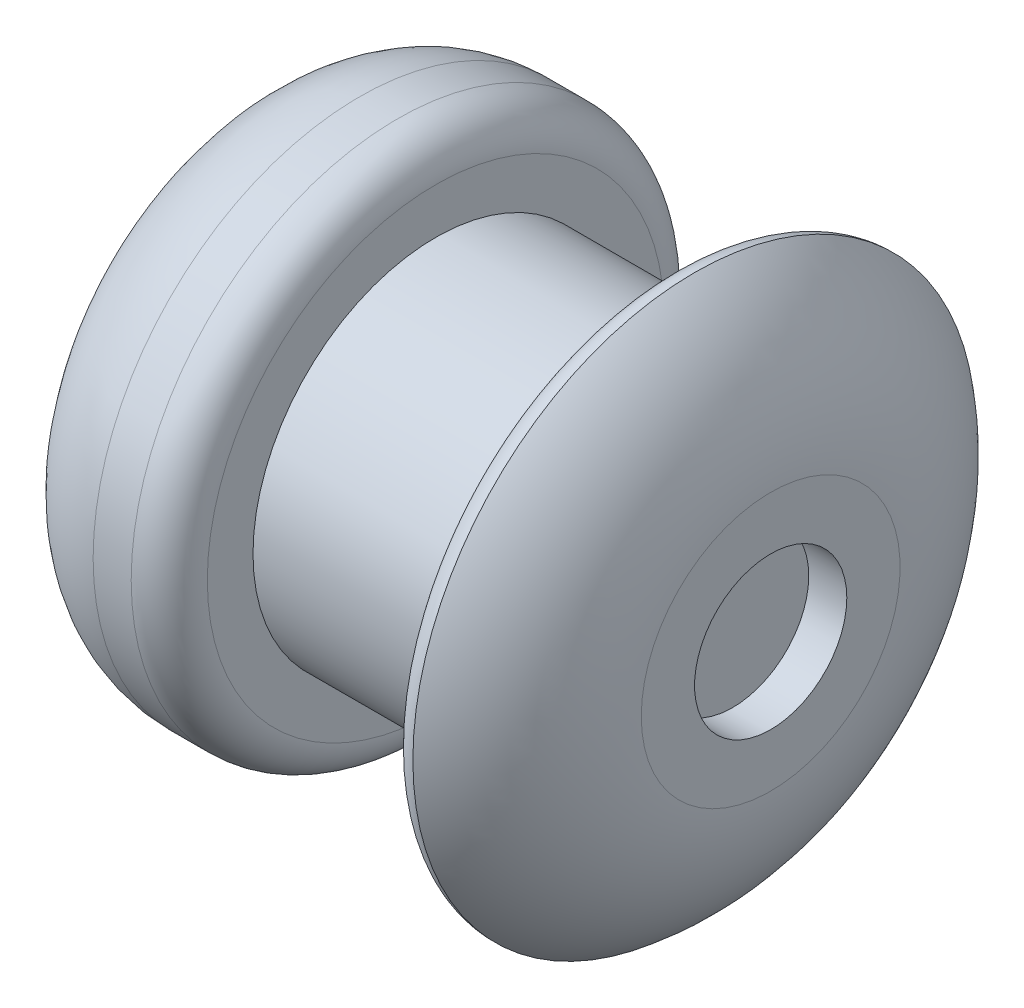
ISO-10303-21;
HEADER;
FILE_DESCRIPTION(('STEP AP214'),'2;1');
FILE_NAME('part.step','',(''),(''),'','','');
FILE_SCHEMA(('AUTOMOTIVE_DESIGN { 1 0 10303 214 1 1 1 1 }'));
ENDSEC;
DATA;
#1=APPLICATION_CONTEXT('core data for automotive mechanical design processes');
#2=APPLICATION_PROTOCOL_DEFINITION('international standard','automotive_design',2000,#1);
#3=PRODUCT_CONTEXT('',#1,'mechanical');
#4=PRODUCT('Part','Part','',(#3));
#5=PRODUCT_RELATED_PRODUCT_CATEGORY('part','',(#4));
#6=PRODUCT_DEFINITION_FORMATION('','',#4);
#7=PRODUCT_DEFINITION_CONTEXT('part definition',#1,'design');
#8=PRODUCT_DEFINITION('design','',#6,#7);
#9=PRODUCT_DEFINITION_SHAPE('','',#8);
#10=(LENGTH_UNIT() NAMED_UNIT(*) SI_UNIT(.MILLI.,.METRE.));
#11=(NAMED_UNIT(*) PLANE_ANGLE_UNIT() SI_UNIT($,.RADIAN.));
#12=(NAMED_UNIT(*) SI_UNIT($,.STERADIAN.) SOLID_ANGLE_UNIT());
#13=UNCERTAINTY_MEASURE_WITH_UNIT(LENGTH_MEASURE(1.E-05),#10,'distance_accuracy_value','');
#14=(GEOMETRIC_REPRESENTATION_CONTEXT(3) GLOBAL_UNCERTAINTY_ASSIGNED_CONTEXT((#13)) GLOBAL_UNIT_ASSIGNED_CONTEXT((#10,
#11,#12)) REPRESENTATION_CONTEXT('',''));
#15=CARTESIAN_POINT('',(0.,0.,0.));
#16=DIRECTION('',(0.,0.,1.));
#17=DIRECTION('',(1.,0.,0.));
#18=AXIS2_PLACEMENT_3D('',#15,#16,#17);
#19=CARTESIAN_POINT('',(7.94999999999996,0.,0.));
#20=DIRECTION('',(-1.,0.,0.));
#21=DIRECTION('',(0.,0.,1.));
#22=AXIS2_PLACEMENT_3D('',#19,#20,#21);
#23=CYLINDRICAL_SURFACE('',#22,2.4);
#24=CARTESIAN_POINT('',(7.94999999999996,0.,0.));
#25=DIRECTION('',(1.,0.,0.));
#26=DIRECTION('',(0.,0.,-1.));
#27=AXIS2_PLACEMENT_3D('',#24,#25,#26);
#28=CIRCLE('',#27,2.4);
#29=CARTESIAN_POINT('',(7.94999999999996,0.,-2.39999999999994));
#30=VERTEX_POINT('',#29);
#31=EDGE_CURVE('E54',#30,#30,#28,.T.);
#32=ORIENTED_EDGE('',*,*,#31,.F.);
#33=EDGE_LOOP('',(#32));
#34=FACE_BOUND('',#33,.T.);
#35=CARTESIAN_POINT('',(4.85000000000002,0.,0.));
#36=DIRECTION('',(-1.,0.,0.));
#37=DIRECTION('',(0.,0.,1.));
#38=AXIS2_PLACEMENT_3D('',#35,#36,#37);
#39=CIRCLE('',#38,2.4);
#40=CARTESIAN_POINT('',(4.85000000000002,0.,2.40000000000003));
#41=VERTEX_POINT('',#40);
#42=EDGE_CURVE('E55',#41,#41,#39,.T.);
#43=ORIENTED_EDGE('',*,*,#42,.F.);
#44=EDGE_LOOP('',(#43));
#45=FACE_BOUND('',#44,.T.);
#46=ADVANCED_FACE('F34',(#34,#45),#23,.T.);
#47=CARTESIAN_POINT('',(7.94999999999996,0.,0.));
#48=DIRECTION('',(1.,0.,0.));
#49=DIRECTION('',(0.,0.,-1.));
#50=AXIS2_PLACEMENT_3D('',#47,#48,#49);
#51=PLANE('',#50);
#52=CARTESIAN_POINT('',(7.94999999999996,0.,0.));
#53=DIRECTION('',(1.,0.,0.));
#54=DIRECTION('',(0.,0.,-1.));
#55=AXIS2_PLACEMENT_3D('',#52,#53,#54);
#56=CIRCLE('',#55,3.4);
#57=CARTESIAN_POINT('',(7.94999999999996,0.,-3.39999999999994));
#58=VERTEX_POINT('',#57);
#59=EDGE_CURVE('E10',#58,#58,#56,.F.);
#60=ORIENTED_EDGE('',*,*,#59,.T.);
#61=EDGE_LOOP('',(#60));
#62=FACE_BOUND('',#61,.T.);
#63=ORIENTED_EDGE('',*,*,#31,.T.);
#64=EDGE_LOOP('',(#63));
#65=FACE_BOUND('',#64,.T.);
#66=ADVANCED_FACE('F95',(#62,#65),#51,.F.);
#67=CARTESIAN_POINT('',(4.85000000000002,0.,0.));
#68=DIRECTION('',(-1.,0.,0.));
#69=DIRECTION('',(0.,0.,1.));
#70=AXIS2_PLACEMENT_3D('',#67,#68,#69);
#71=PLANE('',#70);
#72=CARTESIAN_POINT('',(4.85000000000002,0.,0.));
#73=DIRECTION('',(-1.,0.,0.));
#74=DIRECTION('',(0.,0.,1.));
#75=AXIS2_PLACEMENT_3D('',#72,#73,#74);
#76=CIRCLE('',#75,3.);
#77=CARTESIAN_POINT('',(4.85000000000002,0.,3.00000000000003));
#78=VERTEX_POINT('',#77);
#79=EDGE_CURVE('E41',#78,#78,#76,.F.);
#80=ORIENTED_EDGE('',*,*,#79,.T.);
#81=EDGE_LOOP('',(#80));
#82=FACE_BOUND('',#81,.T.);
#83=ORIENTED_EDGE('',*,*,#42,.T.);
#84=EDGE_LOOP('',(#83));
#85=FACE_BOUND('',#84,.T.);
#86=ADVANCED_FACE('F101',(#82,#85),#71,.F.);
#87=CARTESIAN_POINT('',(2.35000000000005,0.,0.));
#88=DIRECTION('',(1.,0.,0.));
#89=DIRECTION('',(0.,0.,-1.));
#90=AXIS2_PLACEMENT_3D('',#87,#88,#89);
#91=CYLINDRICAL_SURFACE('',#90,3.5);
#92=CARTESIAN_POINT('',(4.34999999999997,0.,0.));
#93=DIRECTION('',(-1.,0.,0.));
#94=DIRECTION('',(0.,0.,1.));
#95=AXIS2_PLACEMENT_3D('',#92,#93,#94);
#96=CIRCLE('',#95,3.5);
#97=CARTESIAN_POINT('',(4.34999999999997,0.,3.5));
#98=VERTEX_POINT('',#97);
#99=EDGE_CURVE('E45',#98,#98,#96,.T.);
#100=ORIENTED_EDGE('',*,*,#99,.T.);
#101=EDGE_LOOP('',(#100));
#102=FACE_BOUND('',#101,.T.);
#103=CARTESIAN_POINT('',(3.84999999999996,0.,0.));
#104=DIRECTION('',(-1.,0.,0.));
#105=DIRECTION('',(0.,0.,1.));
#106=AXIS2_PLACEMENT_3D('',#103,#104,#105);
#107=CIRCLE('',#106,3.5);
#108=CARTESIAN_POINT('',(3.84999999999996,0.,3.50000000000006));
#109=VERTEX_POINT('',#108);
#110=EDGE_CURVE('E49',#109,#109,#107,.F.);
#111=ORIENTED_EDGE('',*,*,#110,.T.);
#112=EDGE_LOOP('',(#111));
#113=FACE_BOUND('',#112,.T.);
#114=ADVANCED_FACE('F110',(#102,#113),#91,.T.);
#115=CARTESIAN_POINT('',(3.84999999999996,0.,0.));
#116=DIRECTION('',(-1.,0.,0.));
#117=DIRECTION('',(0.,0.,1.));
#118=AXIS2_PLACEMENT_3D('',#115,#116,#117);
#119=TOROIDAL_SURFACE('',#118,2.,1.5);
#120=ORIENTED_EDGE('',*,*,#110,.F.);
#121=EDGE_LOOP('',(#120));
#122=FACE_BOUND('',#121,.T.);
#123=CARTESIAN_POINT('',(2.35000000000005,0.,0.));
#124=DIRECTION('',(-1.,0.,0.));
#125=DIRECTION('',(0.,0.,1.));
#126=AXIS2_PLACEMENT_3D('',#123,#124,#125);
#127=CIRCLE('',#126,2.);
#128=CARTESIAN_POINT('',(2.35000000000005,0.,2.00000000000003));
#129=VERTEX_POINT('',#128);
#130=EDGE_CURVE('E61',#129,#129,#127,.T.);
#131=ORIENTED_EDGE('',*,*,#130,.F.);
#132=EDGE_LOOP('',(#131));
#133=FACE_BOUND('',#132,.T.);
#134=ADVANCED_FACE('F107',(#122,#133),#119,.T.);
#135=CARTESIAN_POINT('',(4.34999999999997,0.,0.));
#136=DIRECTION('',(-1.,0.,0.));
#137=DIRECTION('',(0.,0.,1.));
#138=AXIS2_PLACEMENT_3D('',#135,#136,#137);
#139=TOROIDAL_SURFACE('',#138,3.,0.5);
#140=ORIENTED_EDGE('',*,*,#79,.F.);
#141=EDGE_LOOP('',(#140));
#142=FACE_BOUND('',#141,.T.);
#143=ORIENTED_EDGE('',*,*,#99,.F.);
#144=EDGE_LOOP('',(#143));
#145=FACE_BOUND('',#144,.T.);
#146=ADVANCED_FACE('F109',(#142,#145),#139,.T.);
#147=CARTESIAN_POINT('',(2.84999999999996,0.,0.));
#148=DIRECTION('',(-1.,0.,0.));
#149=DIRECTION('',(0.,0.,1.));
#150=AXIS2_PLACEMENT_3D('',#147,#148,#149);
#151=CYLINDRICAL_SURFACE('',#150,2.);
#152=CARTESIAN_POINT('',(2.84999999999996,0.,0.));
#153=DIRECTION('',(-1.,0.,0.));
#154=DIRECTION('',(0.,0.,1.));
#155=AXIS2_PLACEMENT_3D('',#152,#153,#154);
#156=CIRCLE('',#155,2.);
#157=CARTESIAN_POINT('',(2.84999999999996,0.,2.00000000000003));
#158=VERTEX_POINT('',#157);
#159=EDGE_CURVE('E58',#158,#158,#156,.T.);
#160=ORIENTED_EDGE('',*,*,#159,.F.);
#161=EDGE_LOOP('',(#160));
#162=FACE_BOUND('',#161,.T.);
#163=ORIENTED_EDGE('',*,*,#130,.T.);
#164=EDGE_LOOP('',(#163));
#165=FACE_BOUND('',#164,.T.);
#166=ADVANCED_FACE('F113',(#162,#165),#151,.F.);
#167=CARTESIAN_POINT('',(2.84999999999996,0.,0.));
#168=DIRECTION('',(-1.,0.,0.));
#169=DIRECTION('',(0.,0.,1.));
#170=AXIS2_PLACEMENT_3D('',#167,#168,#169);
#171=PLANE('',#170);
#172=ORIENTED_EDGE('',*,*,#159,.T.);
#173=EDGE_LOOP('',(#172));
#174=FACE_BOUND('',#173,.T.);
#175=ADVANCED_FACE('F92',(#174),#171,.T.);
#176=CARTESIAN_POINT('',(8.24999999999998,0.,0.));
#177=DIRECTION('',(1.,0.,0.));
#178=DIRECTION('',(0.,0.,-1.));
#179=AXIS2_PLACEMENT_3D('',#176,#177,#178);
#180=TOROIDAL_SURFACE('',#179,3.4,0.3);
#181=ORIENTED_EDGE('',*,*,#59,.F.);
#182=EDGE_LOOP('',(#181));
#183=FACE_BOUND('',#182,.T.);
#184=CARTESIAN_POINT('',(8.24999999999998,0.,0.));
#185=DIRECTION('',(-1.,0.,0.));
#186=DIRECTION('',(0.,0.,1.));
#187=AXIS2_PLACEMENT_3D('',#184,#185,#186);
#188=CIRCLE('',#187,3.7);
#189=CARTESIAN_POINT('',(8.24999999999998,0.,3.70000000000006));
#190=VERTEX_POINT('',#189);
#191=EDGE_CURVE('E75',#190,#190,#188,.T.);
#192=ORIENTED_EDGE('',*,*,#191,.T.);
#193=EDGE_LOOP('',(#192));
#194=FACE_BOUND('',#193,.T.);
#195=ADVANCED_FACE('F36',(#183,#194),#180,.T.);
#196=CARTESIAN_POINT('',(6.65047624447823,0.,0.));
#197=DIRECTION('',(-1.,0.,0.));
#198=DIRECTION('',(0.,0.,1.));
#199=AXIS2_PLACEMENT_3D('',#196,#197,#198);
#200=DEGENERATE_TOROIDAL_SURFACE('',#199,1.65023812223914,2.6,.T.);
#201=CARTESIAN_POINT('',(9.24999999999998,0.,0.));
#202=DIRECTION('',(-1.,0.,0.));
#203=DIRECTION('',(0.,0.,1.));
#204=AXIS2_PLACEMENT_3D('',#201,#202,#203);
#205=CIRCLE('',#204,1.7);
#206=CARTESIAN_POINT('',(9.24999999999998,0.,1.70000000000006));
#207=VERTEX_POINT('',#206);
#208=EDGE_CURVE('E70',#207,#207,#205,.T.);
#209=ORIENTED_EDGE('',*,*,#208,.T.);
#210=EDGE_LOOP('',(#209));
#211=FACE_BOUND('',#210,.T.);
#212=ORIENTED_EDGE('',*,*,#191,.F.);
#213=EDGE_LOOP('',(#212));
#214=FACE_BOUND('',#213,.T.);
#215=ADVANCED_FACE('F80',(#211,#214),#200,.T.);
#216=CARTESIAN_POINT('',(8.74999999999995,0.,0.));
#217=DIRECTION('',(1.,0.,0.));
#218=DIRECTION('',(0.,0.,-1.));
#219=AXIS2_PLACEMENT_3D('',#216,#217,#218);
#220=PLANE('',#219);
#221=CARTESIAN_POINT('',(8.74999999999995,0.,0.));
#222=DIRECTION('',(1.,0.,0.));
#223=DIRECTION('',(0.,0.,-1.));
#224=AXIS2_PLACEMENT_3D('',#221,#222,#223);
#225=CIRCLE('',#224,1.);
#226=CARTESIAN_POINT('',(8.74999999999995,0.,-0.999999999999917));
#227=VERTEX_POINT('',#226);
#228=EDGE_CURVE('E64',#227,#227,#225,.T.);
#229=ORIENTED_EDGE('',*,*,#228,.T.);
#230=EDGE_LOOP('',(#229));
#231=FACE_BOUND('',#230,.T.);
#232=ADVANCED_FACE('F82',(#231),#220,.T.);
#233=CARTESIAN_POINT('',(8.74999999999995,0.,0.));
#234=DIRECTION('',(1.,0.,0.));
#235=DIRECTION('',(0.,0.,-1.));
#236=AXIS2_PLACEMENT_3D('',#233,#234,#235);
#237=CYLINDRICAL_SURFACE('',#236,1.);
#238=ORIENTED_EDGE('',*,*,#228,.F.);
#239=EDGE_LOOP('',(#238));
#240=FACE_BOUND('',#239,.T.);
#241=CARTESIAN_POINT('',(9.24999999999998,0.,0.));
#242=DIRECTION('',(1.,0.,0.));
#243=DIRECTION('',(0.,0.,-1.));
#244=AXIS2_PLACEMENT_3D('',#241,#242,#243);
#245=CIRCLE('',#244,1.);
#246=CARTESIAN_POINT('',(9.24999999999998,0.,-0.999999999999944));
#247=VERTEX_POINT('',#246);
#248=EDGE_CURVE('E67',#247,#247,#245,.T.);
#249=ORIENTED_EDGE('',*,*,#248,.T.);
#250=EDGE_LOOP('',(#249));
#251=FACE_BOUND('',#250,.T.);
#252=ADVANCED_FACE('F89',(#240,#251),#237,.F.);
#253=CARTESIAN_POINT('',(9.24999999999998,0.,0.));
#254=DIRECTION('',(1.,0.,0.));
#255=DIRECTION('',(0.,0.,-1.));
#256=AXIS2_PLACEMENT_3D('',#253,#254,#255);
#257=PLANE('',#256);
#258=ORIENTED_EDGE('',*,*,#248,.F.);
#259=EDGE_LOOP('',(#258));
#260=FACE_BOUND('',#259,.T.);
#261=ORIENTED_EDGE('',*,*,#208,.F.);
#262=EDGE_LOOP('',(#261));
#263=FACE_BOUND('',#262,.T.);
#264=ADVANCED_FACE('F134',(#260,#263),#257,.T.);
#265=CLOSED_SHELL('',(#46,#66,#86,#114,#134,#146,#166,#175,#195,#215,#232,#252,#264));
#266=MANIFOLD_SOLID_BREP('B2',#265);
#267=ADVANCED_BREP_SHAPE_REPRESENTATION('',(#18,#266),#14);
#268=SHAPE_DEFINITION_REPRESENTATION(#9,#267);
ENDSEC;
END-ISO-10303-21;
